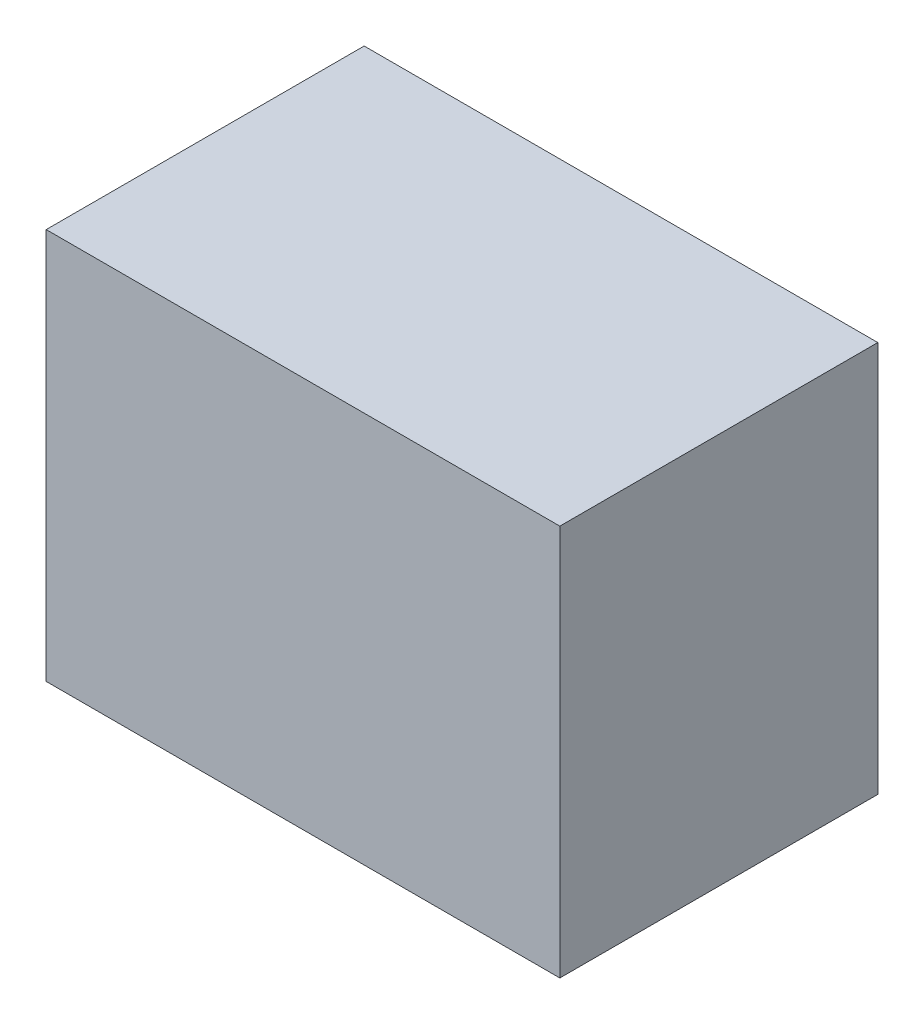
ISO-10303-21;
HEADER;
FILE_DESCRIPTION(('STEP AP214'),'2;1');
FILE_NAME('part.step','',(''),(''),'','','');
FILE_SCHEMA(('AUTOMOTIVE_DESIGN { 1 0 10303 214 1 1 1 1 }'));
ENDSEC;
DATA;
#1=APPLICATION_CONTEXT('core data for automotive mechanical design processes');
#2=APPLICATION_PROTOCOL_DEFINITION('international standard','automotive_design',2000,#1);
#3=PRODUCT_CONTEXT('',#1,'mechanical');
#4=PRODUCT('Part','Part','',(#3));
#5=PRODUCT_RELATED_PRODUCT_CATEGORY('part','',(#4));
#6=PRODUCT_DEFINITION_FORMATION('','',#4);
#7=PRODUCT_DEFINITION_CONTEXT('part definition',#1,'design');
#8=PRODUCT_DEFINITION('design','',#6,#7);
#9=PRODUCT_DEFINITION_SHAPE('','',#8);
#10=(LENGTH_UNIT() NAMED_UNIT(*) SI_UNIT(.MILLI.,.METRE.));
#11=(NAMED_UNIT(*) PLANE_ANGLE_UNIT() SI_UNIT($,.RADIAN.));
#12=(NAMED_UNIT(*) SI_UNIT($,.STERADIAN.) SOLID_ANGLE_UNIT());
#13=UNCERTAINTY_MEASURE_WITH_UNIT(LENGTH_MEASURE(1.E-05),#10,'distance_accuracy_value','');
#14=(GEOMETRIC_REPRESENTATION_CONTEXT(3) GLOBAL_UNCERTAINTY_ASSIGNED_CONTEXT((#13)) GLOBAL_UNIT_ASSIGNED_CONTEXT((#10,
#11,#12)) REPRESENTATION_CONTEXT('',''));
#15=CARTESIAN_POINT('',(0.,0.,0.));
#16=DIRECTION('',(0.,0.,1.));
#17=DIRECTION('',(1.,0.,0.));
#18=AXIS2_PLACEMENT_3D('',#15,#16,#17);
#19=CARTESIAN_POINT('',(0.,0.,0.));
#20=DIRECTION('',(0.,0.,1.));
#21=DIRECTION('',(1.,0.,0.));
#22=AXIS2_PLACEMENT_3D('',#19,#20,#21);
#23=PLANE('',#22);
#24=DIRECTION('',(0.,-1.,0.));
#25=VECTOR('',#24,1.);
#26=CARTESIAN_POINT('',(-10.,10.,0.));
#27=LINE('',#26,#25);
#28=CARTESIAN_POINT('',(-10.,10.,0.));
#29=VERTEX_POINT('',#28);
#30=CARTESIAN_POINT('',(-9.99999999999996,-310.,0.));
#31=VERTEX_POINT('',#30);
#32=EDGE_CURVE('E104',#29,#31,#27,.T.);
#33=ORIENTED_EDGE('',*,*,#32,.F.);
#34=DIRECTION('',(-1.,0.,0.));
#35=VECTOR('',#34,1.);
#36=CARTESIAN_POINT('',(-10.,10.,0.));
#37=LINE('',#36,#35);
#38=CARTESIAN_POINT('',(410.,10.,0.));
#39=VERTEX_POINT('',#38);
#40=EDGE_CURVE('E156',#39,#29,#37,.T.);
#41=ORIENTED_EDGE('',*,*,#40,.F.);
#42=DIRECTION('',(0.,1.,0.));
#43=VECTOR('',#42,1.);
#44=CARTESIAN_POINT('',(410.,10.,0.));
#45=LINE('',#44,#43);
#46=CARTESIAN_POINT('',(410.,-310.,0.));
#47=VERTEX_POINT('',#46);
#48=EDGE_CURVE('E154',#47,#39,#45,.T.);
#49=ORIENTED_EDGE('',*,*,#48,.F.);
#50=DIRECTION('',(1.,0.,0.));
#51=VECTOR('',#50,1.);
#52=CARTESIAN_POINT('',(-9.99999999999996,-310.,0.));
#53=LINE('',#52,#51);
#54=EDGE_CURVE('E152',#31,#47,#53,.T.);
#55=ORIENTED_EDGE('',*,*,#54,.F.);
#56=EDGE_LOOP('',(#33,#41,#49,#55));
#57=FACE_BOUND('',#56,.T.);
#58=DIRECTION('',(0.,-1.,0.));
#59=VECTOR('',#58,1.);
#60=CARTESIAN_POINT('',(0.,0.,0.));
#61=LINE('',#60,#59);
#62=CARTESIAN_POINT('',(0.,0.,0.));
#63=VERTEX_POINT('',#62);
#64=CARTESIAN_POINT('',(0.,-300.,0.));
#65=VERTEX_POINT('',#64);
#66=EDGE_CURVE('E55',#63,#65,#61,.T.);
#67=ORIENTED_EDGE('',*,*,#66,.T.);
#68=DIRECTION('',(1.,0.,0.));
#69=VECTOR('',#68,1.);
#70=CARTESIAN_POINT('',(0.,-300.,0.));
#71=LINE('',#70,#69);
#72=CARTESIAN_POINT('',(400.,-300.,0.));
#73=VERTEX_POINT('',#72);
#74=EDGE_CURVE('E136',#65,#73,#71,.T.);
#75=ORIENTED_EDGE('',*,*,#74,.T.);
#76=DIRECTION('',(0.,1.,0.));
#77=VECTOR('',#76,1.);
#78=CARTESIAN_POINT('',(400.,0.,0.));
#79=LINE('',#78,#77);
#80=CARTESIAN_POINT('',(400.,0.,0.));
#81=VERTEX_POINT('',#80);
#82=EDGE_CURVE('E139',#73,#81,#79,.T.);
#83=ORIENTED_EDGE('',*,*,#82,.T.);
#84=DIRECTION('',(-1.,0.,0.));
#85=VECTOR('',#84,1.);
#86=CARTESIAN_POINT('',(0.,0.,0.));
#87=LINE('',#86,#85);
#88=EDGE_CURVE('E127',#81,#63,#87,.T.);
#89=ORIENTED_EDGE('',*,*,#88,.T.);
#90=EDGE_LOOP('',(#67,#75,#83,#89));
#91=FACE_BOUND('',#90,.T.);
#92=ADVANCED_FACE('F32',(#57,#91),#23,.F.);
#93=CARTESIAN_POINT('',(-10.,10.,250.));
#94=DIRECTION('',(1.,0.,0.));
#95=DIRECTION('',(0.,1.,0.));
#96=AXIS2_PLACEMENT_3D('',#93,#94,#95);
#97=PLANE('',#96);
#98=ORIENTED_EDGE('',*,*,#32,.T.);
#99=DIRECTION('',(0.,0.,-1.));
#100=VECTOR('',#99,1.);
#101=CARTESIAN_POINT('',(-9.99999999999996,-310.,250.));
#102=LINE('',#101,#100);
#103=CARTESIAN_POINT('',(-10.,-310.,260.));
#104=VERTEX_POINT('',#103);
#105=EDGE_CURVE('E11',#104,#31,#102,.T.);
#106=ORIENTED_EDGE('',*,*,#105,.F.);
#107=DIRECTION('',(0.,-1.,0.));
#108=VECTOR('',#107,1.);
#109=CARTESIAN_POINT('',(-10.,10.,260.));
#110=LINE('',#109,#108);
#111=CARTESIAN_POINT('',(-10.,10.,260.));
#112=VERTEX_POINT('',#111);
#113=EDGE_CURVE('E102',#112,#104,#110,.T.);
#114=ORIENTED_EDGE('',*,*,#113,.F.);
#115=DIRECTION('',(0.,0.,-1.));
#116=VECTOR('',#115,1.);
#117=CARTESIAN_POINT('',(-10.,10.,250.));
#118=LINE('',#117,#116);
#119=EDGE_CURVE('E158',#112,#29,#118,.T.);
#120=ORIENTED_EDGE('',*,*,#119,.T.);
#121=EDGE_LOOP('',(#98,#106,#114,#120));
#122=FACE_BOUND('',#121,.T.);
#123=ADVANCED_FACE('F34',(#122),#97,.F.);
#124=CARTESIAN_POINT('',(-9.99999999999996,-310.,250.));
#125=DIRECTION('',(0.,1.,0.));
#126=DIRECTION('',(0.,0.,1.));
#127=AXIS2_PLACEMENT_3D('',#124,#125,#126);
#128=PLANE('',#127);
#129=ORIENTED_EDGE('',*,*,#54,.T.);
#130=DIRECTION('',(0.,0.,-1.));
#131=VECTOR('',#130,1.);
#132=CARTESIAN_POINT('',(410.,-310.,250.));
#133=LINE('',#132,#131);
#134=CARTESIAN_POINT('',(410.,-310.,260.));
#135=VERTEX_POINT('',#134);
#136=EDGE_CURVE('E40',#135,#47,#133,.T.);
#137=ORIENTED_EDGE('',*,*,#136,.F.);
#138=DIRECTION('',(1.,0.,0.));
#139=VECTOR('',#138,1.);
#140=CARTESIAN_POINT('',(-10.,-310.,260.));
#141=LINE('',#140,#139);
#142=EDGE_CURVE('E107',#104,#135,#141,.T.);
#143=ORIENTED_EDGE('',*,*,#142,.F.);
#144=ORIENTED_EDGE('',*,*,#105,.T.);
#145=EDGE_LOOP('',(#129,#137,#143,#144));
#146=FACE_BOUND('',#145,.T.);
#147=ADVANCED_FACE('F108',(#146),#128,.F.);
#148=CARTESIAN_POINT('',(410.,10.,250.));
#149=DIRECTION('',(-1.,0.,0.));
#150=DIRECTION('',(0.,0.,1.));
#151=AXIS2_PLACEMENT_3D('',#148,#149,#150);
#152=PLANE('',#151);
#153=ORIENTED_EDGE('',*,*,#48,.T.);
#154=DIRECTION('',(0.,0.,-1.));
#155=VECTOR('',#154,1.);
#156=CARTESIAN_POINT('',(410.,10.,250.));
#157=LINE('',#156,#155);
#158=CARTESIAN_POINT('',(410.,10.,260.));
#159=VERTEX_POINT('',#158);
#160=EDGE_CURVE('E160',#159,#39,#157,.T.);
#161=ORIENTED_EDGE('',*,*,#160,.F.);
#162=DIRECTION('',(0.,1.,0.));
#163=VECTOR('',#162,1.);
#164=CARTESIAN_POINT('',(410.,10.,260.));
#165=LINE('',#164,#163);
#166=EDGE_CURVE('E113',#135,#159,#165,.T.);
#167=ORIENTED_EDGE('',*,*,#166,.F.);
#168=ORIENTED_EDGE('',*,*,#136,.T.);
#169=EDGE_LOOP('',(#153,#161,#167,#168));
#170=FACE_BOUND('',#169,.T.);
#171=ADVANCED_FACE('F164',(#170),#152,.F.);
#172=CARTESIAN_POINT('',(-10.,10.,250.));
#173=DIRECTION('',(0.,-1.,0.));
#174=DIRECTION('',(0.,0.,-1.));
#175=AXIS2_PLACEMENT_3D('',#172,#173,#174);
#176=PLANE('',#175);
#177=ORIENTED_EDGE('',*,*,#40,.T.);
#178=ORIENTED_EDGE('',*,*,#119,.F.);
#179=DIRECTION('',(-1.,0.,0.));
#180=VECTOR('',#179,1.);
#181=CARTESIAN_POINT('',(-10.,10.,260.));
#182=LINE('',#181,#180);
#183=EDGE_CURVE('E118',#159,#112,#182,.T.);
#184=ORIENTED_EDGE('',*,*,#183,.F.);
#185=ORIENTED_EDGE('',*,*,#160,.T.);
#186=EDGE_LOOP('',(#177,#178,#184,#185));
#187=FACE_BOUND('',#186,.T.);
#188=ADVANCED_FACE('F169',(#187),#176,.F.);
#189=CARTESIAN_POINT('',(0.,0.,250.));
#190=DIRECTION('',(1.,0.,0.));
#191=DIRECTION('',(0.,1.,0.));
#192=AXIS2_PLACEMENT_3D('',#189,#190,#191);
#193=PLANE('',#192);
#194=ORIENTED_EDGE('',*,*,#66,.F.);
#195=DIRECTION('',(0.,0.,-1.));
#196=VECTOR('',#195,1.);
#197=CARTESIAN_POINT('',(0.,0.,250.));
#198=LINE('',#197,#196);
#199=CARTESIAN_POINT('',(0.,0.,250.));
#200=VERTEX_POINT('',#199);
#201=EDGE_CURVE('E134',#200,#63,#198,.T.);
#202=ORIENTED_EDGE('',*,*,#201,.F.);
#203=DIRECTION('',(0.,-1.,0.));
#204=VECTOR('',#203,1.);
#205=CARTESIAN_POINT('',(0.,0.,250.));
#206=LINE('',#205,#204);
#207=CARTESIAN_POINT('',(0.,-300.,250.));
#208=VERTEX_POINT('',#207);
#209=EDGE_CURVE('E123',#200,#208,#206,.T.);
#210=ORIENTED_EDGE('',*,*,#209,.T.);
#211=DIRECTION('',(0.,0.,-1.));
#212=VECTOR('',#211,1.);
#213=CARTESIAN_POINT('',(0.,-300.,250.));
#214=LINE('',#213,#212);
#215=EDGE_CURVE('E149',#208,#65,#214,.T.);
#216=ORIENTED_EDGE('',*,*,#215,.T.);
#217=EDGE_LOOP('',(#194,#202,#210,#216));
#218=FACE_BOUND('',#217,.T.);
#219=ADVANCED_FACE('F171',(#218),#193,.T.);
#220=CARTESIAN_POINT('',(0.,-300.,250.));
#221=DIRECTION('',(0.,1.,0.));
#222=DIRECTION('',(0.,0.,1.));
#223=AXIS2_PLACEMENT_3D('',#220,#221,#222);
#224=PLANE('',#223);
#225=ORIENTED_EDGE('',*,*,#74,.F.);
#226=ORIENTED_EDGE('',*,*,#215,.F.);
#227=DIRECTION('',(1.,0.,0.));
#228=VECTOR('',#227,1.);
#229=CARTESIAN_POINT('',(0.,-300.,250.));
#230=LINE('',#229,#228);
#231=CARTESIAN_POINT('',(400.,-300.,250.));
#232=VERTEX_POINT('',#231);
#233=EDGE_CURVE('E126',#208,#232,#230,.T.);
#234=ORIENTED_EDGE('',*,*,#233,.T.);
#235=DIRECTION('',(0.,0.,-1.));
#236=VECTOR('',#235,1.);
#237=CARTESIAN_POINT('',(400.,-300.,250.));
#238=LINE('',#237,#236);
#239=EDGE_CURVE('E147',#232,#73,#238,.T.);
#240=ORIENTED_EDGE('',*,*,#239,.T.);
#241=EDGE_LOOP('',(#225,#226,#234,#240));
#242=FACE_BOUND('',#241,.T.);
#243=ADVANCED_FACE('F177',(#242),#224,.T.);
#244=CARTESIAN_POINT('',(400.,0.,250.));
#245=DIRECTION('',(-1.,0.,0.));
#246=DIRECTION('',(0.,-1.,0.));
#247=AXIS2_PLACEMENT_3D('',#244,#245,#246);
#248=PLANE('',#247);
#249=ORIENTED_EDGE('',*,*,#82,.F.);
#250=ORIENTED_EDGE('',*,*,#239,.F.);
#251=DIRECTION('',(0.,1.,0.));
#252=VECTOR('',#251,1.);
#253=CARTESIAN_POINT('',(400.,0.,250.));
#254=LINE('',#253,#252);
#255=CARTESIAN_POINT('',(400.,0.,250.));
#256=VERTEX_POINT('',#255);
#257=EDGE_CURVE('E130',#232,#256,#254,.T.);
#258=ORIENTED_EDGE('',*,*,#257,.T.);
#259=DIRECTION('',(0.,0.,-1.));
#260=VECTOR('',#259,1.);
#261=CARTESIAN_POINT('',(400.,0.,250.));
#262=LINE('',#261,#260);
#263=EDGE_CURVE('E145',#256,#81,#262,.T.);
#264=ORIENTED_EDGE('',*,*,#263,.T.);
#265=EDGE_LOOP('',(#249,#250,#258,#264));
#266=FACE_BOUND('',#265,.T.);
#267=ADVANCED_FACE('F188',(#266),#248,.T.);
#268=CARTESIAN_POINT('',(0.,0.,250.));
#269=DIRECTION('',(0.,-1.,0.));
#270=DIRECTION('',(0.,0.,-1.));
#271=AXIS2_PLACEMENT_3D('',#268,#269,#270);
#272=PLANE('',#271);
#273=ORIENTED_EDGE('',*,*,#88,.F.);
#274=ORIENTED_EDGE('',*,*,#263,.F.);
#275=DIRECTION('',(-1.,0.,0.));
#276=VECTOR('',#275,1.);
#277=CARTESIAN_POINT('',(0.,0.,250.));
#278=LINE('',#277,#276);
#279=EDGE_CURVE('E47',#256,#200,#278,.T.);
#280=ORIENTED_EDGE('',*,*,#279,.T.);
#281=ORIENTED_EDGE('',*,*,#201,.T.);
#282=EDGE_LOOP('',(#273,#274,#280,#281));
#283=FACE_BOUND('',#282,.T.);
#284=ADVANCED_FACE('F192',(#283),#272,.T.);
#285=CARTESIAN_POINT('',(0.,0.,250.));
#286=DIRECTION('',(0.,0.,1.));
#287=DIRECTION('',(1.,0.,0.));
#288=AXIS2_PLACEMENT_3D('',#285,#286,#287);
#289=PLANE('',#288);
#290=ORIENTED_EDGE('',*,*,#233,.F.);
#291=ORIENTED_EDGE('',*,*,#209,.F.);
#292=ORIENTED_EDGE('',*,*,#279,.F.);
#293=ORIENTED_EDGE('',*,*,#257,.F.);
#294=EDGE_LOOP('',(#290,#291,#292,#293));
#295=FACE_BOUND('',#294,.T.);
#296=ADVANCED_FACE('F196',(#295),#289,.F.);
#297=CARTESIAN_POINT('',(0.,0.,260.));
#298=DIRECTION('',(0.,0.,1.));
#299=DIRECTION('',(1.,0.,0.));
#300=AXIS2_PLACEMENT_3D('',#297,#298,#299);
#301=PLANE('',#300);
#302=ORIENTED_EDGE('',*,*,#113,.T.);
#303=ORIENTED_EDGE('',*,*,#142,.T.);
#304=ORIENTED_EDGE('',*,*,#166,.T.);
#305=ORIENTED_EDGE('',*,*,#183,.T.);
#306=EDGE_LOOP('',(#302,#303,#304,#305));
#307=FACE_BOUND('',#306,.T.);
#308=ADVANCED_FACE('F116',(#307),#301,.T.);
#309=CLOSED_SHELL('',(#92,#123,#147,#171,#188,#219,#243,#267,#284,#296,#308));
#310=MANIFOLD_SOLID_BREP('B2',#309);
#311=ADVANCED_BREP_SHAPE_REPRESENTATION('',(#18,#310),#14);
#312=SHAPE_DEFINITION_REPRESENTATION(#9,#311);
ENDSEC;
END-ISO-10303-21;
